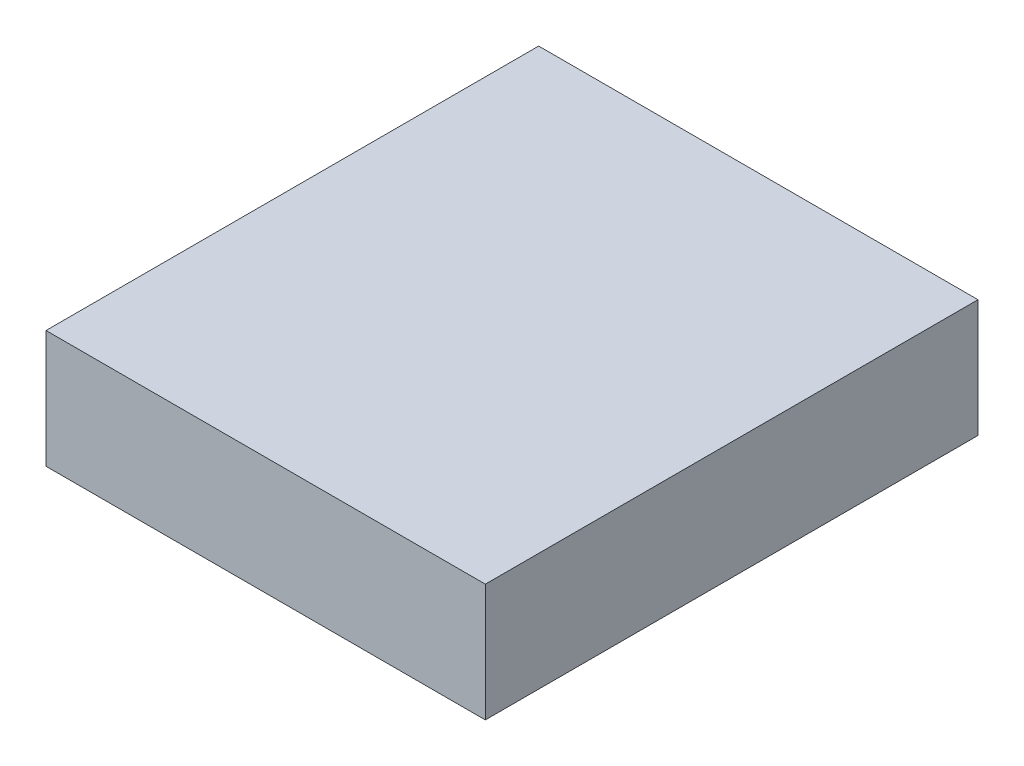
ISO-10303-21;
HEADER;
FILE_DESCRIPTION(('STEP AP214'),'2;1');
FILE_NAME('part.step','',(''),(''),'','','');
FILE_SCHEMA(('AUTOMOTIVE_DESIGN { 1 0 10303 214 1 1 1 1 }'));
ENDSEC;
DATA;
#1=APPLICATION_CONTEXT('core data for automotive mechanical design processes');
#2=APPLICATION_PROTOCOL_DEFINITION('international standard','automotive_design',2000,#1);
#3=PRODUCT_CONTEXT('',#1,'mechanical');
#4=PRODUCT('Part','Part','',(#3));
#5=PRODUCT_RELATED_PRODUCT_CATEGORY('part','',(#4));
#6=PRODUCT_DEFINITION_FORMATION('','',#4);
#7=PRODUCT_DEFINITION_CONTEXT('part definition',#1,'design');
#8=PRODUCT_DEFINITION('design','',#6,#7);
#9=PRODUCT_DEFINITION_SHAPE('','',#8);
#10=(LENGTH_UNIT() NAMED_UNIT(*) SI_UNIT(.MILLI.,.METRE.));
#11=(NAMED_UNIT(*) PLANE_ANGLE_UNIT() SI_UNIT($,.RADIAN.));
#12=(NAMED_UNIT(*) SI_UNIT($,.STERADIAN.) SOLID_ANGLE_UNIT());
#13=UNCERTAINTY_MEASURE_WITH_UNIT(LENGTH_MEASURE(1.E-05),#10,'distance_accuracy_value','');
#14=(GEOMETRIC_REPRESENTATION_CONTEXT(3) GLOBAL_UNCERTAINTY_ASSIGNED_CONTEXT((#13)) GLOBAL_UNIT_ASSIGNED_CONTEXT((#10,
#11,#12)) REPRESENTATION_CONTEXT('',''));
#15=CARTESIAN_POINT('',(0.,0.,0.));
#16=DIRECTION('',(0.,0.,1.));
#17=DIRECTION('',(1.,0.,0.));
#18=AXIS2_PLACEMENT_3D('',#15,#16,#17);
#19=CARTESIAN_POINT('',(0.,10.,0.));
#20=DIRECTION('',(0.,0.,1.));
#21=DIRECTION('',(1.,0.,0.));
#22=AXIS2_PLACEMENT_3D('',#19,#20,#21);
#23=PLANE('',#22);
#24=DIRECTION('',(-1.,0.,0.));
#25=VECTOR('',#24,1.);
#26=CARTESIAN_POINT('',(0.,0.,0.));
#27=LINE('',#26,#25);
#28=CARTESIAN_POINT('',(0.,0.,0.));
#29=VERTEX_POINT('',#28);
#30=CARTESIAN_POINT('',(-37.3546253796349,0.,0.));
#31=VERTEX_POINT('',#30);
#32=EDGE_CURVE('E100',#29,#31,#27,.T.);
#33=ORIENTED_EDGE('',*,*,#32,.F.);
#34=DIRECTION('',(0.,-1.,0.));
#35=VECTOR('',#34,1.);
#36=CARTESIAN_POINT('',(0.,10.,0.));
#37=LINE('',#36,#35);
#38=CARTESIAN_POINT('',(0.,10.,0.));
#39=VERTEX_POINT('',#38);
#40=EDGE_CURVE('E11',#39,#29,#37,.T.);
#41=ORIENTED_EDGE('',*,*,#40,.F.);
#42=DIRECTION('',(-1.,0.,0.));
#43=VECTOR('',#42,1.);
#44=CARTESIAN_POINT('',(0.,10.,0.));
#45=LINE('',#44,#43);
#46=CARTESIAN_POINT('',(-37.3546253796349,10.,0.));
#47=VERTEX_POINT('',#46);
#48=EDGE_CURVE('E95',#39,#47,#45,.T.);
#49=ORIENTED_EDGE('',*,*,#48,.T.);
#50=DIRECTION('',(0.,-1.,0.));
#51=VECTOR('',#50,1.);
#52=CARTESIAN_POINT('',(-37.3546253796349,10.,0.));
#53=LINE('',#52,#51);
#54=EDGE_CURVE('E38',#47,#31,#53,.T.);
#55=ORIENTED_EDGE('',*,*,#54,.T.);
#56=EDGE_LOOP('',(#33,#41,#49,#55));
#57=FACE_BOUND('',#56,.T.);
#58=ADVANCED_FACE('F35',(#57),#23,.T.);
#59=CARTESIAN_POINT('',(0.,10.,0.));
#60=DIRECTION('',(-1.,0.,0.));
#61=DIRECTION('',(0.,0.,1.));
#62=AXIS2_PLACEMENT_3D('',#59,#60,#61);
#63=PLANE('',#62);
#64=DIRECTION('',(0.,0.,-1.));
#65=VECTOR('',#64,1.);
#66=CARTESIAN_POINT('',(0.,0.,0.));
#67=LINE('',#66,#65);
#68=CARTESIAN_POINT('',(0.,0.,-41.8897477848077));
#69=VERTEX_POINT('',#68);
#70=EDGE_CURVE('E68',#29,#69,#67,.T.);
#71=ORIENTED_EDGE('',*,*,#70,.T.);
#72=DIRECTION('',(0.,-1.,0.));
#73=VECTOR('',#72,1.);
#74=CARTESIAN_POINT('',(0.,10.,-41.8897477848077));
#75=LINE('',#74,#73);
#76=CARTESIAN_POINT('',(0.,10.,-41.8897477848077));
#77=VERTEX_POINT('',#76);
#78=EDGE_CURVE('E44',#77,#69,#75,.T.);
#79=ORIENTED_EDGE('',*,*,#78,.F.);
#80=DIRECTION('',(0.,0.,-1.));
#81=VECTOR('',#80,1.);
#82=CARTESIAN_POINT('',(0.,10.,0.));
#83=LINE('',#82,#81);
#84=EDGE_CURVE('E85',#39,#77,#83,.T.);
#85=ORIENTED_EDGE('',*,*,#84,.F.);
#86=ORIENTED_EDGE('',*,*,#40,.T.);
#87=EDGE_LOOP('',(#71,#79,#85,#86));
#88=FACE_BOUND('',#87,.T.);
#89=ADVANCED_FACE('F110',(#88),#63,.F.);
#90=CARTESIAN_POINT('',(0.,10.,-41.8897477848077));
#91=DIRECTION('',(0.,0.,1.));
#92=DIRECTION('',(1.,0.,0.));
#93=AXIS2_PLACEMENT_3D('',#90,#91,#92);
#94=PLANE('',#93);
#95=DIRECTION('',(-1.,0.,0.));
#96=VECTOR('',#95,1.);
#97=CARTESIAN_POINT('',(0.,0.,-41.8897477848077));
#98=LINE('',#97,#96);
#99=CARTESIAN_POINT('',(-37.3546253796349,0.,-41.8897477848077));
#100=VERTEX_POINT('',#99);
#101=EDGE_CURVE('E92',#69,#100,#98,.T.);
#102=ORIENTED_EDGE('',*,*,#101,.T.);
#103=DIRECTION('',(0.,-1.,0.));
#104=VECTOR('',#103,1.);
#105=CARTESIAN_POINT('',(-37.3546253796349,10.,-41.8897477848077));
#106=LINE('',#105,#104);
#107=CARTESIAN_POINT('',(-37.3546253796349,10.,-41.8897477848077));
#108=VERTEX_POINT('',#107);
#109=EDGE_CURVE('E89',#108,#100,#106,.T.);
#110=ORIENTED_EDGE('',*,*,#109,.F.);
#111=DIRECTION('',(-1.,0.,0.));
#112=VECTOR('',#111,1.);
#113=CARTESIAN_POINT('',(0.,10.,-41.8897477848077));
#114=LINE('',#113,#112);
#115=EDGE_CURVE('E80',#77,#108,#114,.T.);
#116=ORIENTED_EDGE('',*,*,#115,.F.);
#117=ORIENTED_EDGE('',*,*,#78,.T.);
#118=EDGE_LOOP('',(#102,#110,#116,#117));
#119=FACE_BOUND('',#118,.T.);
#120=ADVANCED_FACE('F90',(#119),#94,.F.);
#121=CARTESIAN_POINT('',(-37.3546253796349,10.,0.));
#122=DIRECTION('',(-1.,0.,0.));
#123=DIRECTION('',(0.,0.,1.));
#124=AXIS2_PLACEMENT_3D('',#121,#122,#123);
#125=PLANE('',#124);
#126=DIRECTION('',(0.,0.,-1.));
#127=VECTOR('',#126,1.);
#128=CARTESIAN_POINT('',(-37.3546253796349,0.,0.));
#129=LINE('',#128,#127);
#130=EDGE_CURVE('E103',#31,#100,#129,.T.);
#131=ORIENTED_EDGE('',*,*,#130,.F.);
#132=ORIENTED_EDGE('',*,*,#54,.F.);
#133=DIRECTION('',(0.,0.,-1.));
#134=VECTOR('',#133,1.);
#135=CARTESIAN_POINT('',(-37.3546253796349,10.,0.));
#136=LINE('',#135,#134);
#137=EDGE_CURVE('E84',#47,#108,#136,.T.);
#138=ORIENTED_EDGE('',*,*,#137,.T.);
#139=ORIENTED_EDGE('',*,*,#109,.T.);
#140=EDGE_LOOP('',(#131,#132,#138,#139));
#141=FACE_BOUND('',#140,.T.);
#142=ADVANCED_FACE('F94',(#141),#125,.T.);
#143=CARTESIAN_POINT('',(0.,10.,0.));
#144=DIRECTION('',(0.,-1.,0.));
#145=DIRECTION('',(0.,0.,-1.));
#146=AXIS2_PLACEMENT_3D('',#143,#144,#145);
#147=PLANE('',#146);
#148=ORIENTED_EDGE('',*,*,#48,.F.);
#149=ORIENTED_EDGE('',*,*,#84,.T.);
#150=ORIENTED_EDGE('',*,*,#115,.T.);
#151=ORIENTED_EDGE('',*,*,#137,.F.);
#152=EDGE_LOOP('',(#148,#149,#150,#151));
#153=FACE_BOUND('',#152,.T.);
#154=ADVANCED_FACE('F83',(#153),#147,.F.);
#155=CARTESIAN_POINT('',(0.,0.,0.));
#156=DIRECTION('',(0.,-1.,0.));
#157=DIRECTION('',(0.,0.,-1.));
#158=AXIS2_PLACEMENT_3D('',#155,#156,#157);
#159=PLANE('',#158);
#160=ORIENTED_EDGE('',*,*,#32,.T.);
#161=ORIENTED_EDGE('',*,*,#130,.T.);
#162=ORIENTED_EDGE('',*,*,#101,.F.);
#163=ORIENTED_EDGE('',*,*,#70,.F.);
#164=EDGE_LOOP('',(#160,#161,#162,#163));
#165=FACE_BOUND('',#164,.T.);
#166=ADVANCED_FACE('F108',(#165),#159,.T.);
#167=CLOSED_SHELL('',(#58,#89,#120,#142,#154,#166));
#168=MANIFOLD_SOLID_BREP('B2',#167);
#169=ADVANCED_BREP_SHAPE_REPRESENTATION('',(#18,#168),#14);
#170=SHAPE_DEFINITION_REPRESENTATION(#9,#169);
ENDSEC;
END-ISO-10303-21;
